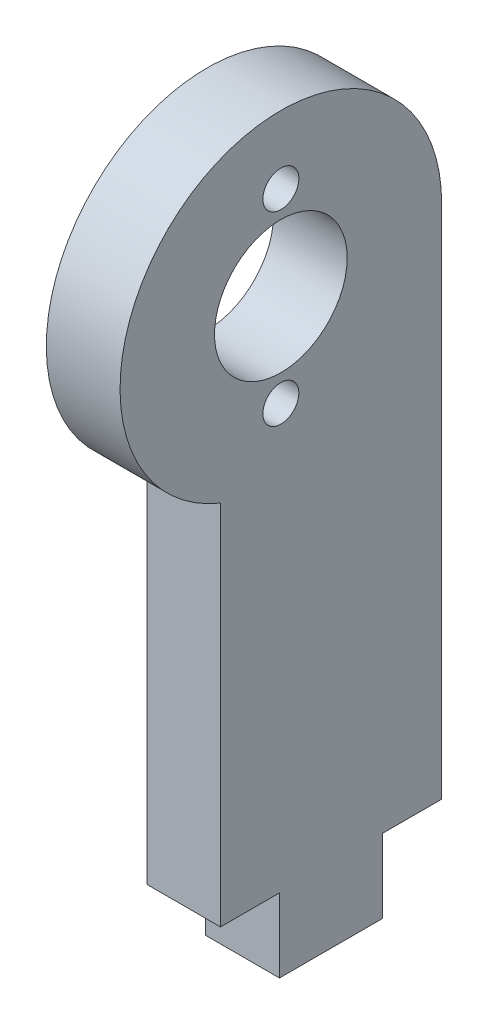
ISO-10303-21;
HEADER;
FILE_DESCRIPTION(('STEP AP214'),'2;1');
FILE_NAME('part.step','',(''),(''),'','','');
FILE_SCHEMA(('AUTOMOTIVE_DESIGN { 1 0 10303 214 1 1 1 1 }'));
ENDSEC;
DATA;
#1=APPLICATION_CONTEXT('core data for automotive mechanical design processes');
#2=APPLICATION_PROTOCOL_DEFINITION('international standard','automotive_design',2000,#1);
#3=PRODUCT_CONTEXT('',#1,'mechanical');
#4=PRODUCT('Part','Part','',(#3));
#5=PRODUCT_RELATED_PRODUCT_CATEGORY('part','',(#4));
#6=PRODUCT_DEFINITION_FORMATION('','',#4);
#7=PRODUCT_DEFINITION_CONTEXT('part definition',#1,'design');
#8=PRODUCT_DEFINITION('design','',#6,#7);
#9=PRODUCT_DEFINITION_SHAPE('','',#8);
#10=(LENGTH_UNIT() NAMED_UNIT(*) SI_UNIT(.MILLI.,.METRE.));
#11=(NAMED_UNIT(*) PLANE_ANGLE_UNIT() SI_UNIT($,.RADIAN.));
#12=(NAMED_UNIT(*) SI_UNIT($,.STERADIAN.) SOLID_ANGLE_UNIT());
#13=UNCERTAINTY_MEASURE_WITH_UNIT(LENGTH_MEASURE(1.E-05),#10,'distance_accuracy_value','');
#14=(GEOMETRIC_REPRESENTATION_CONTEXT(3) GLOBAL_UNCERTAINTY_ASSIGNED_CONTEXT((#13)) GLOBAL_UNIT_ASSIGNED_CONTEXT((#10,
#11,#12)) REPRESENTATION_CONTEXT('',''));
#15=CARTESIAN_POINT('',(0.,0.,0.));
#16=DIRECTION('',(0.,0.,1.));
#17=DIRECTION('',(1.,0.,0.));
#18=AXIS2_PLACEMENT_3D('',#15,#16,#17);
#19=CARTESIAN_POINT('',(6.35,0.,-19.05));
#20=DIRECTION('',(0.,0.,1.));
#21=DIRECTION('',(1.,0.,0.));
#22=AXIS2_PLACEMENT_3D('',#19,#20,#21);
#23=PLANE('',#22);
#24=DIRECTION('',(0.,1.,0.));
#25=VECTOR('',#24,1.);
#26=CARTESIAN_POINT('',(0.,0.,-19.05));
#27=LINE('',#26,#25);
#28=CARTESIAN_POINT('',(0.,6.35,-19.05));
#29=VERTEX_POINT('',#28);
#30=CARTESIAN_POINT('',(0.,50.8,-19.05));
#31=VERTEX_POINT('',#30);
#32=EDGE_CURVE('E136',#29,#31,#27,.T.);
#33=ORIENTED_EDGE('',*,*,#32,.T.);
#34=DIRECTION('',(-1.,0.,0.));
#35=VECTOR('',#34,1.);
#36=CARTESIAN_POINT('',(6.35,50.8,-19.05));
#37=LINE('',#36,#35);
#38=CARTESIAN_POINT('',(6.35,50.8,-19.05));
#39=VERTEX_POINT('',#38);
#40=EDGE_CURVE('E11',#39,#31,#37,.T.);
#41=ORIENTED_EDGE('',*,*,#40,.F.);
#42=DIRECTION('',(0.,1.,0.));
#43=VECTOR('',#42,1.);
#44=CARTESIAN_POINT('',(6.35,0.,-19.05));
#45=LINE('',#44,#43);
#46=CARTESIAN_POINT('',(6.35,6.35,-19.05));
#47=VERTEX_POINT('',#46);
#48=EDGE_CURVE('E186',#47,#39,#45,.T.);
#49=ORIENTED_EDGE('',*,*,#48,.F.);
#50=DIRECTION('',(-1.,0.,0.));
#51=VECTOR('',#50,1.);
#52=CARTESIAN_POINT('',(6.35,6.35,-19.05));
#53=LINE('',#52,#51);
#54=EDGE_CURVE('E52',#47,#29,#53,.T.);
#55=ORIENTED_EDGE('',*,*,#54,.T.);
#56=EDGE_LOOP('',(#33,#41,#49,#55));
#57=FACE_BOUND('',#56,.T.);
#58=ADVANCED_FACE('F35',(#57),#23,.F.);
#59=CARTESIAN_POINT('',(6.35,50.8,-5.2));
#60=DIRECTION('',(-1.,0.,0.));
#61=DIRECTION('',(0.,0.,1.));
#62=AXIS2_PLACEMENT_3D('',#59,#60,#61);
#63=CYLINDRICAL_SURFACE('',#62,13.85);
#64=CARTESIAN_POINT('',(0.,50.8,-5.2));
#65=DIRECTION('',(1.,0.,0.));
#66=DIRECTION('',(0.,0.,-1.));
#67=AXIS2_PLACEMENT_3D('',#64,#65,#66);
#68=CIRCLE('',#67,13.85);
#69=CARTESIAN_POINT('',(0.,37.9632363891828,0.));
#70=VERTEX_POINT('',#69);
#71=EDGE_CURVE('E139',#31,#70,#68,.T.);
#72=ORIENTED_EDGE('',*,*,#71,.T.);
#73=DIRECTION('',(-1.,0.,0.));
#74=VECTOR('',#73,1.);
#75=CARTESIAN_POINT('',(6.35,37.9632363891828,0.));
#76=LINE('',#75,#74);
#77=CARTESIAN_POINT('',(6.35,37.9632363891828,0.));
#78=VERTEX_POINT('',#77);
#79=EDGE_CURVE('E44',#78,#70,#76,.T.);
#80=ORIENTED_EDGE('',*,*,#79,.F.);
#81=CARTESIAN_POINT('',(6.35,50.8,-5.2));
#82=DIRECTION('',(1.,0.,0.));
#83=DIRECTION('',(0.,0.,-1.));
#84=AXIS2_PLACEMENT_3D('',#81,#82,#83);
#85=CIRCLE('',#84,13.85);
#86=EDGE_CURVE('E90',#39,#78,#85,.T.);
#87=ORIENTED_EDGE('',*,*,#86,.F.);
#88=ORIENTED_EDGE('',*,*,#40,.T.);
#89=EDGE_LOOP('',(#72,#80,#87,#88));
#90=FACE_BOUND('',#89,.T.);
#91=ADVANCED_FACE('F169',(#90),#63,.T.);
#92=CARTESIAN_POINT('',(6.35,0.,0.));
#93=DIRECTION('',(0.,0.,1.));
#94=DIRECTION('',(0.,-1.,0.));
#95=AXIS2_PLACEMENT_3D('',#92,#93,#94);
#96=PLANE('',#95);
#97=DIRECTION('',(0.,1.,0.));
#98=VECTOR('',#97,1.);
#99=CARTESIAN_POINT('',(0.,0.,0.));
#100=LINE('',#99,#98);
#101=CARTESIAN_POINT('',(0.,6.35,0.));
#102=VERTEX_POINT('',#101);
#103=EDGE_CURVE('E142',#102,#70,#100,.T.);
#104=ORIENTED_EDGE('',*,*,#103,.F.);
#105=DIRECTION('',(-1.,0.,0.));
#106=VECTOR('',#105,1.);
#107=CARTESIAN_POINT('',(6.35,6.35,0.));
#108=LINE('',#107,#106);
#109=CARTESIAN_POINT('',(6.35,6.35,0.));
#110=VERTEX_POINT('',#109);
#111=EDGE_CURVE('E162',#110,#102,#108,.T.);
#112=ORIENTED_EDGE('',*,*,#111,.F.);
#113=DIRECTION('',(0.,1.,0.));
#114=VECTOR('',#113,1.);
#115=CARTESIAN_POINT('',(6.35,0.,0.));
#116=LINE('',#115,#114);
#117=EDGE_CURVE('E168',#110,#78,#116,.T.);
#118=ORIENTED_EDGE('',*,*,#117,.T.);
#119=ORIENTED_EDGE('',*,*,#79,.T.);
#120=EDGE_LOOP('',(#104,#112,#118,#119));
#121=FACE_BOUND('',#120,.T.);
#122=ADVANCED_FACE('F166',(#121),#96,.T.);
#123=CARTESIAN_POINT('',(6.35,6.35,0.));
#124=DIRECTION('',(0.,1.,0.));
#125=DIRECTION('',(0.,0.,1.));
#126=AXIS2_PLACEMENT_3D('',#123,#124,#125);
#127=PLANE('',#126);
#128=DIRECTION('',(0.,0.,-1.));
#129=VECTOR('',#128,1.);
#130=CARTESIAN_POINT('',(0.,6.35,0.));
#131=LINE('',#130,#129);
#132=CARTESIAN_POINT('',(0.,6.35,-5.08));
#133=VERTEX_POINT('',#132);
#134=EDGE_CURVE('E145',#102,#133,#131,.T.);
#135=ORIENTED_EDGE('',*,*,#134,.T.);
#136=DIRECTION('',(-1.,0.,0.));
#137=VECTOR('',#136,1.);
#138=CARTESIAN_POINT('',(6.35,6.35,-5.08));
#139=LINE('',#138,#137);
#140=CARTESIAN_POINT('',(6.35,6.35,-5.08));
#141=VERTEX_POINT('',#140);
#142=EDGE_CURVE('E159',#141,#133,#139,.T.);
#143=ORIENTED_EDGE('',*,*,#142,.F.);
#144=DIRECTION('',(0.,0.,-1.));
#145=VECTOR('',#144,1.);
#146=CARTESIAN_POINT('',(6.35,6.35,0.));
#147=LINE('',#146,#145);
#148=EDGE_CURVE('E181',#110,#141,#147,.T.);
#149=ORIENTED_EDGE('',*,*,#148,.F.);
#150=ORIENTED_EDGE('',*,*,#111,.T.);
#151=EDGE_LOOP('',(#135,#143,#149,#150));
#152=FACE_BOUND('',#151,.T.);
#153=ADVANCED_FACE('F177',(#152),#127,.F.);
#154=CARTESIAN_POINT('',(6.35,0.,-5.08));
#155=DIRECTION('',(0.,0.,-1.));
#156=DIRECTION('',(0.,1.,0.));
#157=AXIS2_PLACEMENT_3D('',#154,#155,#156);
#158=PLANE('',#157);
#159=DIRECTION('',(0.,-1.,0.));
#160=VECTOR('',#159,1.);
#161=CARTESIAN_POINT('',(0.,0.,-5.08));
#162=LINE('',#161,#160);
#163=CARTESIAN_POINT('',(0.,0.,-5.08));
#164=VERTEX_POINT('',#163);
#165=EDGE_CURVE('E147',#133,#164,#162,.T.);
#166=ORIENTED_EDGE('',*,*,#165,.T.);
#167=DIRECTION('',(-1.,0.,0.));
#168=VECTOR('',#167,1.);
#169=CARTESIAN_POINT('',(6.35,0.,-5.08));
#170=LINE('',#169,#168);
#171=CARTESIAN_POINT('',(6.35,0.,-5.08));
#172=VERTEX_POINT('',#171);
#173=EDGE_CURVE('E125',#172,#164,#170,.T.);
#174=ORIENTED_EDGE('',*,*,#173,.F.);
#175=DIRECTION('',(0.,-1.,0.));
#176=VECTOR('',#175,1.);
#177=CARTESIAN_POINT('',(6.35,0.,-5.08));
#178=LINE('',#177,#176);
#179=EDGE_CURVE('E113',#141,#172,#178,.T.);
#180=ORIENTED_EDGE('',*,*,#179,.F.);
#181=ORIENTED_EDGE('',*,*,#142,.T.);
#182=EDGE_LOOP('',(#166,#174,#180,#181));
#183=FACE_BOUND('',#182,.T.);
#184=ADVANCED_FACE('F180',(#183),#158,.F.);
#185=CARTESIAN_POINT('',(6.35,0.,0.));
#186=DIRECTION('',(0.,1.,0.));
#187=DIRECTION('',(0.,0.,1.));
#188=AXIS2_PLACEMENT_3D('',#185,#186,#187);
#189=PLANE('',#188);
#190=DIRECTION('',(0.,0.,-1.));
#191=VECTOR('',#190,1.);
#192=CARTESIAN_POINT('',(0.,0.,0.));
#193=LINE('',#192,#191);
#194=CARTESIAN_POINT('',(0.,0.,-13.97));
#195=VERTEX_POINT('',#194);
#196=EDGE_CURVE('E122',#164,#195,#193,.T.);
#197=ORIENTED_EDGE('',*,*,#196,.T.);
#198=DIRECTION('',(-1.,0.,0.));
#199=VECTOR('',#198,1.);
#200=CARTESIAN_POINT('',(6.35,0.,-13.97));
#201=LINE('',#200,#199);
#202=CARTESIAN_POINT('',(6.35,0.,-13.97));
#203=VERTEX_POINT('',#202);
#204=EDGE_CURVE('E119',#203,#195,#201,.T.);
#205=ORIENTED_EDGE('',*,*,#204,.F.);
#206=DIRECTION('',(0.,0.,-1.));
#207=VECTOR('',#206,1.);
#208=CARTESIAN_POINT('',(6.35,0.,0.));
#209=LINE('',#208,#207);
#210=EDGE_CURVE('E106',#172,#203,#209,.T.);
#211=ORIENTED_EDGE('',*,*,#210,.F.);
#212=ORIENTED_EDGE('',*,*,#173,.T.);
#213=EDGE_LOOP('',(#197,#205,#211,#212));
#214=FACE_BOUND('',#213,.T.);
#215=ADVANCED_FACE('F120',(#214),#189,.F.);
#216=CARTESIAN_POINT('',(6.35,0.,-13.97));
#217=DIRECTION('',(0.,0.,-1.));
#218=DIRECTION('',(0.,1.,0.));
#219=AXIS2_PLACEMENT_3D('',#216,#217,#218);
#220=PLANE('',#219);
#221=DIRECTION('',(0.,-1.,0.));
#222=VECTOR('',#221,1.);
#223=CARTESIAN_POINT('',(0.,0.,-13.97));
#224=LINE('',#223,#222);
#225=CARTESIAN_POINT('',(0.,6.35,-13.97));
#226=VERTEX_POINT('',#225);
#227=EDGE_CURVE('E150',#226,#195,#224,.T.);
#228=ORIENTED_EDGE('',*,*,#227,.F.);
#229=DIRECTION('',(-1.,0.,0.));
#230=VECTOR('',#229,1.);
#231=CARTESIAN_POINT('',(6.35,6.35,-13.97));
#232=LINE('',#231,#230);
#233=CARTESIAN_POINT('',(6.35,6.35,-13.97));
#234=VERTEX_POINT('',#233);
#235=EDGE_CURVE('E78',#234,#226,#232,.T.);
#236=ORIENTED_EDGE('',*,*,#235,.F.);
#237=DIRECTION('',(0.,-1.,0.));
#238=VECTOR('',#237,1.);
#239=CARTESIAN_POINT('',(6.35,0.,-13.97));
#240=LINE('',#239,#238);
#241=EDGE_CURVE('E111',#234,#203,#240,.T.);
#242=ORIENTED_EDGE('',*,*,#241,.T.);
#243=ORIENTED_EDGE('',*,*,#204,.T.);
#244=EDGE_LOOP('',(#228,#236,#242,#243));
#245=FACE_BOUND('',#244,.T.);
#246=ADVANCED_FACE('F127',(#245),#220,.T.);
#247=CARTESIAN_POINT('',(6.35,50.8,-5.2));
#248=DIRECTION('',(-1.,0.,0.));
#249=DIRECTION('',(0.,0.,1.));
#250=AXIS2_PLACEMENT_3D('',#247,#248,#249);
#251=CYLINDRICAL_SURFACE('',#250,5.715);
#252=CARTESIAN_POINT('',(6.35,50.8,-5.2));
#253=DIRECTION('',(1.,0.,0.));
#254=DIRECTION('',(0.,0.,-1.));
#255=AXIS2_PLACEMENT_3D('',#252,#253,#254);
#256=CIRCLE('',#255,5.715);
#257=CARTESIAN_POINT('',(6.35,50.8,-10.915));
#258=VERTEX_POINT('',#257);
#259=EDGE_CURVE('E155',#258,#258,#256,.T.);
#260=ORIENTED_EDGE('',*,*,#259,.T.);
#261=EDGE_LOOP('',(#260));
#262=FACE_BOUND('',#261,.T.);
#263=CARTESIAN_POINT('',(0.,50.8,-5.2));
#264=DIRECTION('',(1.,0.,0.));
#265=DIRECTION('',(0.,0.,-1.));
#266=AXIS2_PLACEMENT_3D('',#263,#264,#265);
#267=CIRCLE('',#266,5.715);
#268=CARTESIAN_POINT('',(0.,50.8,-10.915));
#269=VERTEX_POINT('',#268);
#270=EDGE_CURVE('E133',#269,#269,#267,.T.);
#271=ORIENTED_EDGE('',*,*,#270,.F.);
#272=EDGE_LOOP('',(#271));
#273=FACE_BOUND('',#272,.T.);
#274=ADVANCED_FACE('F37',(#262,#273),#251,.F.);
#275=CARTESIAN_POINT('',(6.35,6.34999999999999,0.));
#276=DIRECTION('',(0.,-1.,0.));
#277=DIRECTION('',(0.,0.,-1.));
#278=AXIS2_PLACEMENT_3D('',#275,#276,#277);
#279=PLANE('',#278);
#280=DIRECTION('',(0.,0.,1.));
#281=VECTOR('',#280,1.);
#282=CARTESIAN_POINT('',(0.,6.34999999999999,0.));
#283=LINE('',#282,#281);
#284=EDGE_CURVE('E152',#29,#226,#283,.T.);
#285=ORIENTED_EDGE('',*,*,#284,.F.);
#286=ORIENTED_EDGE('',*,*,#54,.F.);
#287=DIRECTION('',(0.,0.,1.));
#288=VECTOR('',#287,1.);
#289=CARTESIAN_POINT('',(6.35,6.34999999999999,0.));
#290=LINE('',#289,#288);
#291=EDGE_CURVE('E128',#47,#234,#290,.T.);
#292=ORIENTED_EDGE('',*,*,#291,.T.);
#293=ORIENTED_EDGE('',*,*,#235,.T.);
#294=EDGE_LOOP('',(#285,#286,#292,#293));
#295=FACE_BOUND('',#294,.T.);
#296=ADVANCED_FACE('F206',(#295),#279,.T.);
#297=CARTESIAN_POINT('',(6.35,0.,0.));
#298=DIRECTION('',(1.,0.,0.));
#299=DIRECTION('',(0.,0.,-1.));
#300=AXIS2_PLACEMENT_3D('',#297,#298,#299);
#301=PLANE('',#300);
#302=CARTESIAN_POINT('',(6.35,58.8,-5.2));
#303=DIRECTION('',(1.,0.,0.));
#304=DIRECTION('',(0.,0.,-1.));
#305=AXIS2_PLACEMENT_3D('',#302,#303,#304);
#306=CIRCLE('',#305,1.54999999999999);
#307=CARTESIAN_POINT('',(6.35,58.8,-6.74999999999999));
#308=VERTEX_POINT('',#307);
#309=EDGE_CURVE('E198',#308,#308,#306,.T.);
#310=ORIENTED_EDGE('',*,*,#309,.F.);
#311=EDGE_LOOP('',(#310));
#312=FACE_BOUND('',#311,.T.);
#313=CARTESIAN_POINT('',(6.35,42.8,-5.2));
#314=DIRECTION('',(1.,0.,0.));
#315=DIRECTION('',(0.,0.,-1.));
#316=AXIS2_PLACEMENT_3D('',#313,#314,#315);
#317=CIRCLE('',#316,1.54999999999999);
#318=CARTESIAN_POINT('',(6.35,42.8,-6.74999999999999));
#319=VERTEX_POINT('',#318);
#320=EDGE_CURVE('E192',#319,#319,#317,.T.);
#321=ORIENTED_EDGE('',*,*,#320,.F.);
#322=EDGE_LOOP('',(#321));
#323=FACE_BOUND('',#322,.T.);
#324=ORIENTED_EDGE('',*,*,#259,.F.);
#325=EDGE_LOOP('',(#324));
#326=FACE_BOUND('',#325,.T.);
#327=ORIENTED_EDGE('',*,*,#48,.T.);
#328=ORIENTED_EDGE('',*,*,#86,.T.);
#329=ORIENTED_EDGE('',*,*,#117,.F.);
#330=ORIENTED_EDGE('',*,*,#148,.T.);
#331=ORIENTED_EDGE('',*,*,#179,.T.);
#332=ORIENTED_EDGE('',*,*,#210,.T.);
#333=ORIENTED_EDGE('',*,*,#241,.F.);
#334=ORIENTED_EDGE('',*,*,#291,.F.);
#335=EDGE_LOOP('',(#327,#328,#329,#330,#331,#332,#333,#334));
#336=FACE_BOUND('',#335,.T.);
#337=ADVANCED_FACE('F108',(#312,#323,#326,#336),#301,.T.);
#338=CARTESIAN_POINT('',(0.,0.,0.));
#339=DIRECTION('',(1.,0.,0.));
#340=DIRECTION('',(0.,0.,-1.));
#341=AXIS2_PLACEMENT_3D('',#338,#339,#340);
#342=PLANE('',#341);
#343=CARTESIAN_POINT('',(0.,58.8,-5.2));
#344=DIRECTION('',(1.,0.,0.));
#345=DIRECTION('',(0.,0.,-1.));
#346=AXIS2_PLACEMENT_3D('',#343,#344,#345);
#347=CIRCLE('',#346,1.55);
#348=CARTESIAN_POINT('',(0.,58.8,-6.75));
#349=VERTEX_POINT('',#348);
#350=EDGE_CURVE('E195',#349,#349,#347,.T.);
#351=ORIENTED_EDGE('',*,*,#350,.T.);
#352=EDGE_LOOP('',(#351));
#353=FACE_BOUND('',#352,.T.);
#354=CARTESIAN_POINT('',(0.,42.8,-5.2));
#355=DIRECTION('',(1.,0.,0.));
#356=DIRECTION('',(0.,0.,-1.));
#357=AXIS2_PLACEMENT_3D('',#354,#355,#356);
#358=CIRCLE('',#357,1.55);
#359=CARTESIAN_POINT('',(0.,42.8,-6.75));
#360=VERTEX_POINT('',#359);
#361=EDGE_CURVE('E137',#360,#360,#358,.T.);
#362=ORIENTED_EDGE('',*,*,#361,.T.);
#363=EDGE_LOOP('',(#362));
#364=FACE_BOUND('',#363,.T.);
#365=ORIENTED_EDGE('',*,*,#270,.T.);
#366=EDGE_LOOP('',(#365));
#367=FACE_BOUND('',#366,.T.);
#368=ORIENTED_EDGE('',*,*,#32,.F.);
#369=ORIENTED_EDGE('',*,*,#284,.T.);
#370=ORIENTED_EDGE('',*,*,#227,.T.);
#371=ORIENTED_EDGE('',*,*,#196,.F.);
#372=ORIENTED_EDGE('',*,*,#165,.F.);
#373=ORIENTED_EDGE('',*,*,#134,.F.);
#374=ORIENTED_EDGE('',*,*,#103,.T.);
#375=ORIENTED_EDGE('',*,*,#71,.F.);
#376=EDGE_LOOP('',(#368,#369,#370,#371,#372,#373,#374,#375));
#377=FACE_BOUND('',#376,.T.);
#378=ADVANCED_FACE('F173',(#353,#364,#367,#377),#342,.F.);
#379=CARTESIAN_POINT('',(6.35,42.8,-5.2));
#380=DIRECTION('',(1.,0.,0.));
#381=DIRECTION('',(0.,0.,-1.));
#382=AXIS2_PLACEMENT_3D('',#379,#380,#381);
#383=CYLINDRICAL_SURFACE('',#382,1.54999999999999);
#384=ORIENTED_EDGE('',*,*,#361,.F.);
#385=EDGE_LOOP('',(#384));
#386=FACE_BOUND('',#385,.T.);
#387=ORIENTED_EDGE('',*,*,#320,.T.);
#388=EDGE_LOOP('',(#387));
#389=FACE_BOUND('',#388,.T.);
#390=ADVANCED_FACE('F217',(#386,#389),#383,.F.);
#391=CARTESIAN_POINT('',(6.35,58.8,-5.2));
#392=DIRECTION('',(1.,0.,0.));
#393=DIRECTION('',(0.,0.,-1.));
#394=AXIS2_PLACEMENT_3D('',#391,#392,#393);
#395=CYLINDRICAL_SURFACE('',#394,1.54999999999999);
#396=ORIENTED_EDGE('',*,*,#350,.F.);
#397=EDGE_LOOP('',(#396));
#398=FACE_BOUND('',#397,.T.);
#399=ORIENTED_EDGE('',*,*,#309,.T.);
#400=EDGE_LOOP('',(#399));
#401=FACE_BOUND('',#400,.T.);
#402=ADVANCED_FACE('F202',(#398,#401),#395,.F.);
#403=CLOSED_SHELL('',(#58,#91,#122,#153,#184,#215,#246,#274,#296,#337,#378,#390,#402));
#404=MANIFOLD_SOLID_BREP('B2',#403);
#405=ADVANCED_BREP_SHAPE_REPRESENTATION('',(#18,#404),#14);
#406=SHAPE_DEFINITION_REPRESENTATION(#9,#405);
ENDSEC;
END-ISO-10303-21;
